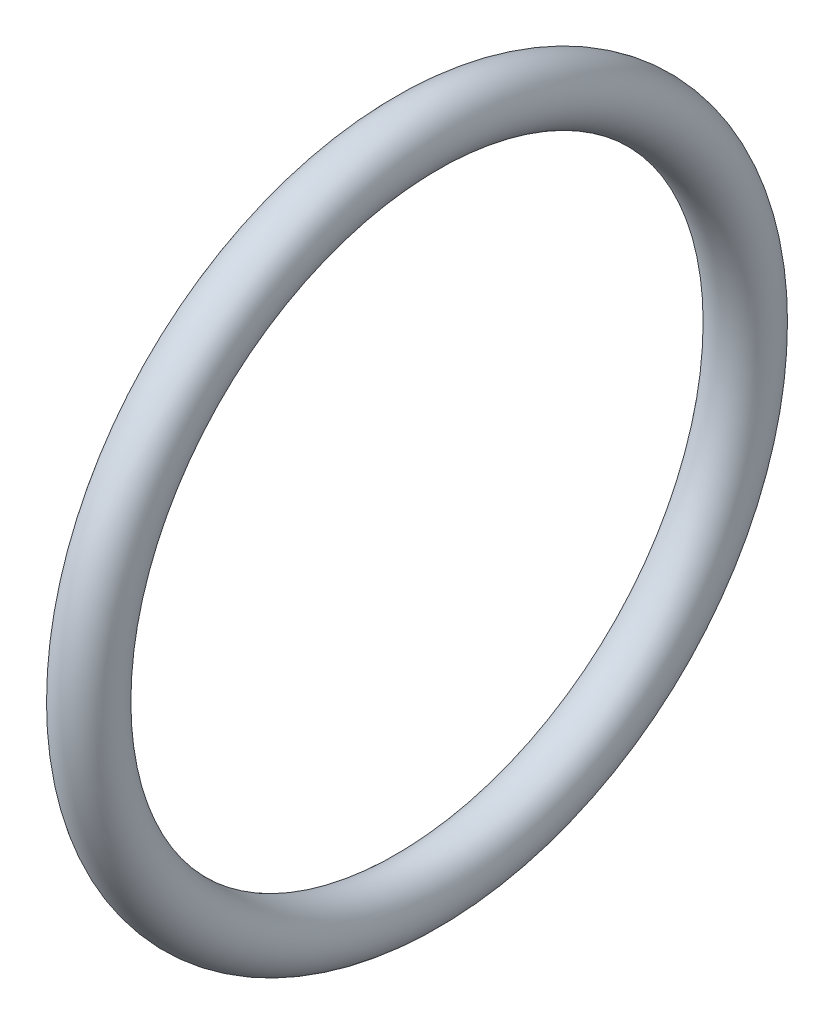
ISO-10303-21;
HEADER;
FILE_DESCRIPTION(('STEP AP214'),'2;1');
FILE_NAME('part.step','',(''),(''),'','','');
FILE_SCHEMA(('AUTOMOTIVE_DESIGN { 1 0 10303 214 1 1 1 1 }'));
ENDSEC;
DATA;
#1=APPLICATION_CONTEXT('core data for automotive mechanical design processes');
#2=APPLICATION_PROTOCOL_DEFINITION('international standard','automotive_design',2000,#1);
#3=PRODUCT_CONTEXT('',#1,'mechanical');
#4=PRODUCT('Part','Part','',(#3));
#5=PRODUCT_RELATED_PRODUCT_CATEGORY('part','',(#4));
#6=PRODUCT_DEFINITION_FORMATION('','',#4);
#7=PRODUCT_DEFINITION_CONTEXT('part definition',#1,'design');
#8=PRODUCT_DEFINITION('design','',#6,#7);
#9=PRODUCT_DEFINITION_SHAPE('','',#8);
#10=(LENGTH_UNIT() NAMED_UNIT(*) SI_UNIT(.MILLI.,.METRE.));
#11=(NAMED_UNIT(*) PLANE_ANGLE_UNIT() SI_UNIT($,.RADIAN.));
#12=(NAMED_UNIT(*) SI_UNIT($,.STERADIAN.) SOLID_ANGLE_UNIT());
#13=UNCERTAINTY_MEASURE_WITH_UNIT(LENGTH_MEASURE(1.E-05),#10,'distance_accuracy_value','');
#14=(GEOMETRIC_REPRESENTATION_CONTEXT(3) GLOBAL_UNCERTAINTY_ASSIGNED_CONTEXT((#13)) GLOBAL_UNIT_ASSIGNED_CONTEXT((#10,
#11,#12)) REPRESENTATION_CONTEXT('',''));
#15=CARTESIAN_POINT('',(0.,0.,0.));
#16=DIRECTION('',(0.,0.,1.));
#17=DIRECTION('',(1.,0.,0.));
#18=AXIS2_PLACEMENT_3D('',#15,#16,#17);
#19=CARTESIAN_POINT('',(0.,0.,0.));
#20=DIRECTION('',(-1.,0.,0.));
#21=DIRECTION('',(0.,0.,1.));
#22=AXIS2_PLACEMENT_3D('',#19,#20,#21);
#23=TOROIDAL_SURFACE('',#22,27.5,2.5);
#24=CARTESIAN_POINT('',(0.,0.,30.));
#25=VERTEX_POINT('',#24);
#26=VERTEX_LOOP('',#25);
#27=FACE_BOUND('',#26,.T.);
#28=ADVANCED_FACE('F35',(#27),#23,.T.);
#29=CLOSED_SHELL('',(#28));
#30=MANIFOLD_SOLID_BREP('B2',#29);
#31=ADVANCED_BREP_SHAPE_REPRESENTATION('',(#18,#30),#14);
#32=SHAPE_DEFINITION_REPRESENTATION(#9,#31);
ENDSEC;
END-ISO-10303-21;
